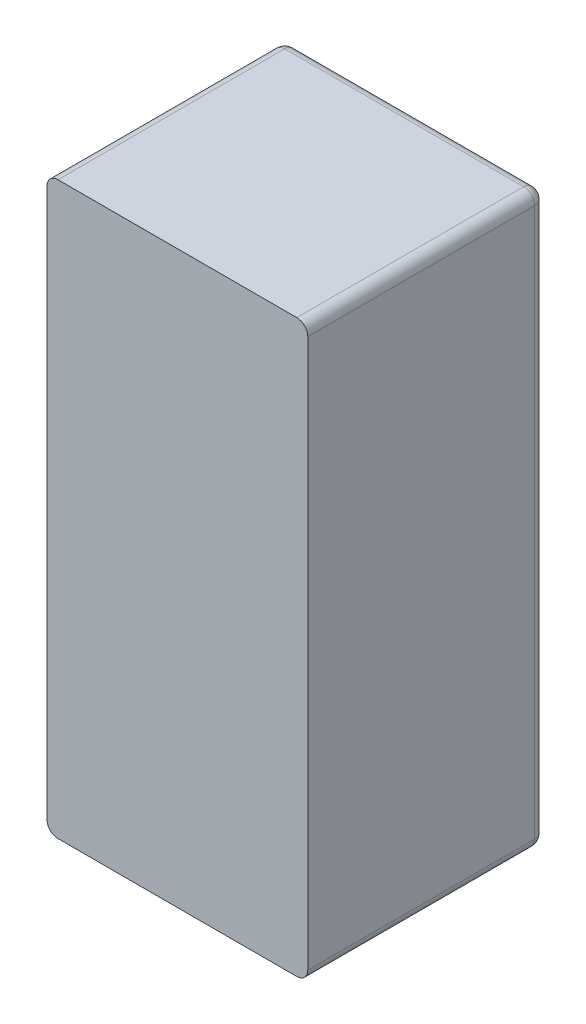
ISO-10303-21;
HEADER;
FILE_DESCRIPTION(('STEP AP214'),'2;1');
FILE_NAME('part.step','',(''),(''),'','','');
FILE_SCHEMA(('AUTOMOTIVE_DESIGN { 1 0 10303 214 1 1 1 1 }'));
ENDSEC;
DATA;
#1=APPLICATION_CONTEXT('core data for automotive mechanical design processes');
#2=APPLICATION_PROTOCOL_DEFINITION('international standard','automotive_design',2000,#1);
#3=PRODUCT_CONTEXT('',#1,'mechanical');
#4=PRODUCT('Part','Part','',(#3));
#5=PRODUCT_RELATED_PRODUCT_CATEGORY('part','',(#4));
#6=PRODUCT_DEFINITION_FORMATION('','',#4);
#7=PRODUCT_DEFINITION_CONTEXT('part definition',#1,'design');
#8=PRODUCT_DEFINITION('design','',#6,#7);
#9=PRODUCT_DEFINITION_SHAPE('','',#8);
#10=(LENGTH_UNIT() NAMED_UNIT(*) SI_UNIT(.MILLI.,.METRE.));
#11=(NAMED_UNIT(*) PLANE_ANGLE_UNIT() SI_UNIT($,.RADIAN.));
#12=(NAMED_UNIT(*) SI_UNIT($,.STERADIAN.) SOLID_ANGLE_UNIT());
#13=UNCERTAINTY_MEASURE_WITH_UNIT(LENGTH_MEASURE(1.E-05),#10,'distance_accuracy_value','');
#14=(GEOMETRIC_REPRESENTATION_CONTEXT(3) GLOBAL_UNCERTAINTY_ASSIGNED_CONTEXT((#13)) GLOBAL_UNIT_ASSIGNED_CONTEXT((#10,
#11,#12)) REPRESENTATION_CONTEXT('',''));
#15=CARTESIAN_POINT('',(0.,0.,0.));
#16=DIRECTION('',(0.,0.,1.));
#17=DIRECTION('',(1.,0.,0.));
#18=AXIS2_PLACEMENT_3D('',#15,#16,#17);
#19=CARTESIAN_POINT('',(0.,520.7,0.));
#20=DIRECTION('',(-1.,0.,0.));
#21=DIRECTION('',(0.,0.,1.));
#22=AXIS2_PLACEMENT_3D('',#19,#20,#21);
#23=PLANE('',#22);
#24=DIRECTION('',(0.,-1.,0.));
#25=VECTOR('',#24,1.);
#26=CARTESIAN_POINT('',(0.,520.7,10.));
#27=LINE('',#26,#25);
#28=CARTESIAN_POINT('',(0.,10.,10.));
#29=VERTEX_POINT('',#28);
#30=CARTESIAN_POINT('',(0.,510.7,10.));
#31=VERTEX_POINT('',#30);
#32=EDGE_CURVE('E125',#29,#31,#27,.F.);
#33=ORIENTED_EDGE('',*,*,#32,.T.);
#34=DIRECTION('',(0.,0.,-1.));
#35=VECTOR('',#34,1.);
#36=CARTESIAN_POINT('',(0.,510.7,0.));
#37=LINE('',#36,#35);
#38=CARTESIAN_POINT('',(0.,510.7,216.916));
#39=VERTEX_POINT('',#38);
#40=EDGE_CURVE('E167',#31,#39,#37,.F.);
#41=ORIENTED_EDGE('',*,*,#40,.T.);
#42=DIRECTION('',(0.,-1.,0.));
#43=VECTOR('',#42,1.);
#44=CARTESIAN_POINT('',(0.,520.7,216.916));
#45=LINE('',#44,#43);
#46=CARTESIAN_POINT('',(0.,10.,216.916));
#47=VERTEX_POINT('',#46);
#48=EDGE_CURVE('E245',#39,#47,#45,.T.);
#49=ORIENTED_EDGE('',*,*,#48,.T.);
#50=DIRECTION('',(0.,0.,-1.));
#51=VECTOR('',#50,1.);
#52=CARTESIAN_POINT('',(0.,10.,0.));
#53=LINE('',#52,#51);
#54=EDGE_CURVE('E157',#47,#29,#53,.T.);
#55=ORIENTED_EDGE('',*,*,#54,.T.);
#56=EDGE_LOOP('',(#33,#41,#49,#55));
#57=FACE_BOUND('',#56,.T.);
#58=ADVANCED_FACE('F39',(#57),#23,.F.);
#59=CARTESIAN_POINT('',(0.,520.7,0.));
#60=DIRECTION('',(0.,0.,1.));
#61=DIRECTION('',(1.,0.,0.));
#62=AXIS2_PLACEMENT_3D('',#59,#60,#61);
#63=PLANE('',#62);
#64=DIRECTION('',(-1.,0.,0.));
#65=VECTOR('',#64,1.);
#66=CARTESIAN_POINT('',(0.,510.7,0.));
#67=LINE('',#66,#65);
#68=CARTESIAN_POINT('',(-227.998,510.7,0.));
#69=VERTEX_POINT('',#68);
#70=CARTESIAN_POINT('',(-10.,510.7,0.));
#71=VERTEX_POINT('',#70);
#72=EDGE_CURVE('E154',#69,#71,#67,.F.);
#73=ORIENTED_EDGE('',*,*,#72,.T.);
#74=DIRECTION('',(0.,-1.,0.));
#75=VECTOR('',#74,1.);
#76=CARTESIAN_POINT('',(-10.,520.7,0.));
#77=LINE('',#76,#75);
#78=CARTESIAN_POINT('',(-10.,10.,0.));
#79=VERTEX_POINT('',#78);
#80=EDGE_CURVE('E123',#71,#79,#77,.T.);
#81=ORIENTED_EDGE('',*,*,#80,.T.);
#82=DIRECTION('',(-1.,0.,0.));
#83=VECTOR('',#82,1.);
#84=CARTESIAN_POINT('',(-237.998,10.,0.));
#85=LINE('',#84,#83);
#86=CARTESIAN_POINT('',(-227.998,10.,0.));
#87=VERTEX_POINT('',#86);
#88=EDGE_CURVE('E142',#79,#87,#85,.T.);
#89=ORIENTED_EDGE('',*,*,#88,.T.);
#90=DIRECTION('',(0.,-1.,0.));
#91=VECTOR('',#90,1.);
#92=CARTESIAN_POINT('',(-227.998,520.7,0.));
#93=LINE('',#92,#91);
#94=EDGE_CURVE('E149',#87,#69,#93,.F.);
#95=ORIENTED_EDGE('',*,*,#94,.T.);
#96=EDGE_LOOP('',(#73,#81,#89,#95));
#97=FACE_BOUND('',#96,.T.);
#98=ADVANCED_FACE('F152',(#97),#63,.F.);
#99=CARTESIAN_POINT('',(-237.998,520.7,0.));
#100=DIRECTION('',(1.,0.,0.));
#101=DIRECTION('',(0.,0.,-1.));
#102=AXIS2_PLACEMENT_3D('',#99,#100,#101);
#103=PLANE('',#102);
#104=DIRECTION('',(0.,-1.,0.));
#105=VECTOR('',#104,1.);
#106=CARTESIAN_POINT('',(-237.998,520.7,216.916));
#107=LINE('',#106,#105);
#108=CARTESIAN_POINT('',(-237.998,510.7,216.916));
#109=VERTEX_POINT('',#108);
#110=CARTESIAN_POINT('',(-237.998,10.,216.916));
#111=VERTEX_POINT('',#110);
#112=EDGE_CURVE('E150',#109,#111,#107,.T.);
#113=ORIENTED_EDGE('',*,*,#112,.F.);
#114=DIRECTION('',(0.,0.,1.));
#115=VECTOR('',#114,1.);
#116=CARTESIAN_POINT('',(-237.998,510.7,0.));
#117=LINE('',#116,#115);
#118=CARTESIAN_POINT('',(-237.998,510.7,10.));
#119=VERTEX_POINT('',#118);
#120=EDGE_CURVE('E185',#109,#119,#117,.F.);
#121=ORIENTED_EDGE('',*,*,#120,.T.);
#122=DIRECTION('',(0.,-1.,0.));
#123=VECTOR('',#122,1.);
#124=CARTESIAN_POINT('',(-237.998,520.7,10.));
#125=LINE('',#124,#123);
#126=CARTESIAN_POINT('',(-237.998,10.,10.));
#127=VERTEX_POINT('',#126);
#128=EDGE_CURVE('E182',#119,#127,#125,.T.);
#129=ORIENTED_EDGE('',*,*,#128,.T.);
#130=DIRECTION('',(0.,0.,1.));
#131=VECTOR('',#130,1.);
#132=CARTESIAN_POINT('',(-237.998,10.,216.916));
#133=LINE('',#132,#131);
#134=EDGE_CURVE('E179',#127,#111,#133,.T.);
#135=ORIENTED_EDGE('',*,*,#134,.T.);
#136=EDGE_LOOP('',(#113,#121,#129,#135));
#137=FACE_BOUND('',#136,.T.);
#138=ADVANCED_FACE('F296',(#137),#103,.F.);
#139=CARTESIAN_POINT('',(0.,520.7,216.916));
#140=DIRECTION('',(0.,0.,-1.));
#141=DIRECTION('',(-1.,0.,0.));
#142=AXIS2_PLACEMENT_3D('',#139,#140,#141);
#143=PLANE('',#142);
#144=DIRECTION('',(1.,0.,0.));
#145=VECTOR('',#144,1.);
#146=CARTESIAN_POINT('',(0.,520.7,216.916));
#147=LINE('',#146,#145);
#148=CARTESIAN_POINT('',(-227.998,520.7,216.916));
#149=VERTEX_POINT('',#148);
#150=CARTESIAN_POINT('',(-10.,520.7,216.916));
#151=VERTEX_POINT('',#150);
#152=EDGE_CURVE('E239',#149,#151,#147,.T.);
#153=ORIENTED_EDGE('',*,*,#152,.F.);
#154=CARTESIAN_POINT('',(-227.998,510.7,216.916));
#155=DIRECTION('',(0.,0.,-1.));
#156=DIRECTION('',(-1.,0.,0.));
#157=AXIS2_PLACEMENT_3D('',#154,#155,#156);
#158=CIRCLE('',#157,10.);
#159=EDGE_CURVE('E11',#149,#109,#158,.F.);
#160=ORIENTED_EDGE('',*,*,#159,.T.);
#161=ORIENTED_EDGE('',*,*,#112,.T.);
#162=CARTESIAN_POINT('',(-227.998,10.,216.916));
#163=DIRECTION('',(0.,0.,-1.));
#164=DIRECTION('',(-1.,0.,0.));
#165=AXIS2_PLACEMENT_3D('',#162,#163,#164);
#166=CIRCLE('',#165,10.);
#167=CARTESIAN_POINT('',(-227.998,0.,216.916));
#168=VERTEX_POINT('',#167);
#169=EDGE_CURVE('E49',#111,#168,#166,.F.);
#170=ORIENTED_EDGE('',*,*,#169,.T.);
#171=DIRECTION('',(1.,0.,0.));
#172=VECTOR('',#171,1.);
#173=CARTESIAN_POINT('',(0.,0.,216.916));
#174=LINE('',#173,#172);
#175=CARTESIAN_POINT('',(-10.,0.,216.916));
#176=VERTEX_POINT('',#175);
#177=EDGE_CURVE('E235',#168,#176,#174,.T.);
#178=ORIENTED_EDGE('',*,*,#177,.T.);
#179=CARTESIAN_POINT('',(-10.,10.,216.916));
#180=DIRECTION('',(0.,0.,-1.));
#181=DIRECTION('',(-1.,0.,0.));
#182=AXIS2_PLACEMENT_3D('',#179,#180,#181);
#183=CIRCLE('',#182,10.);
#184=EDGE_CURVE('E195',#176,#47,#183,.F.);
#185=ORIENTED_EDGE('',*,*,#184,.T.);
#186=ORIENTED_EDGE('',*,*,#48,.F.);
#187=CARTESIAN_POINT('',(-10.,510.7,216.916));
#188=DIRECTION('',(0.,0.,-1.));
#189=DIRECTION('',(-1.,0.,0.));
#190=AXIS2_PLACEMENT_3D('',#187,#188,#189);
#191=CIRCLE('',#190,10.);
#192=EDGE_CURVE('E198',#39,#151,#191,.F.);
#193=ORIENTED_EDGE('',*,*,#192,.T.);
#194=EDGE_LOOP('',(#153,#160,#161,#170,#178,#185,#186,#193));
#195=FACE_BOUND('',#194,.T.);
#196=ADVANCED_FACE('F396',(#195),#143,.F.);
#197=CARTESIAN_POINT('',(0.,520.7,0.));
#198=DIRECTION('',(0.,-1.,0.));
#199=DIRECTION('',(0.,0.,-1.));
#200=AXIS2_PLACEMENT_3D('',#197,#198,#199);
#201=PLANE('',#200);
#202=DIRECTION('',(-1.,0.,0.));
#203=VECTOR('',#202,1.);
#204=CARTESIAN_POINT('',(0.,520.7,10.));
#205=LINE('',#204,#203);
#206=CARTESIAN_POINT('',(-10.,520.7,10.));
#207=VERTEX_POINT('',#206);
#208=CARTESIAN_POINT('',(-227.998,520.7,10.));
#209=VERTEX_POINT('',#208);
#210=EDGE_CURVE('E173',#207,#209,#205,.T.);
#211=ORIENTED_EDGE('',*,*,#210,.T.);
#212=DIRECTION('',(0.,0.,1.));
#213=VECTOR('',#212,1.);
#214=CARTESIAN_POINT('',(-227.998,520.7,0.));
#215=LINE('',#214,#213);
#216=EDGE_CURVE('E176',#209,#149,#215,.T.);
#217=ORIENTED_EDGE('',*,*,#216,.T.);
#218=ORIENTED_EDGE('',*,*,#152,.T.);
#219=DIRECTION('',(0.,0.,-1.));
#220=VECTOR('',#219,1.);
#221=CARTESIAN_POINT('',(-10.,520.7,0.));
#222=LINE('',#221,#220);
#223=EDGE_CURVE('E170',#151,#207,#222,.T.);
#224=ORIENTED_EDGE('',*,*,#223,.T.);
#225=EDGE_LOOP('',(#211,#217,#218,#224));
#226=FACE_BOUND('',#225,.T.);
#227=ADVANCED_FACE('F388',(#226),#201,.F.);
#228=CARTESIAN_POINT('',(0.,0.,0.));
#229=DIRECTION('',(0.,-1.,0.));
#230=DIRECTION('',(0.,0.,-1.));
#231=AXIS2_PLACEMENT_3D('',#228,#229,#230);
#232=PLANE('',#231);
#233=ORIENTED_EDGE('',*,*,#177,.F.);
#234=DIRECTION('',(0.,0.,1.));
#235=VECTOR('',#234,1.);
#236=CARTESIAN_POINT('',(-227.998,0.,0.));
#237=LINE('',#236,#235);
#238=CARTESIAN_POINT('',(-227.998,0.,10.));
#239=VERTEX_POINT('',#238);
#240=EDGE_CURVE('E57',#168,#239,#237,.F.);
#241=ORIENTED_EDGE('',*,*,#240,.T.);
#242=DIRECTION('',(-1.,0.,0.));
#243=VECTOR('',#242,1.);
#244=CARTESIAN_POINT('',(0.,0.,10.));
#245=LINE('',#244,#243);
#246=CARTESIAN_POINT('',(-10.,0.,10.));
#247=VERTEX_POINT('',#246);
#248=EDGE_CURVE('E62',#239,#247,#245,.F.);
#249=ORIENTED_EDGE('',*,*,#248,.T.);
#250=DIRECTION('',(0.,0.,-1.));
#251=VECTOR('',#250,1.);
#252=CARTESIAN_POINT('',(-10.,0.,216.916));
#253=LINE('',#252,#251);
#254=EDGE_CURVE('E188',#247,#176,#253,.F.);
#255=ORIENTED_EDGE('',*,*,#254,.T.);
#256=EDGE_LOOP('',(#233,#241,#249,#255));
#257=FACE_BOUND('',#256,.T.);
#258=ADVANCED_FACE('F276',(#257),#232,.T.);
#259=CARTESIAN_POINT('',(-227.998,510.7,0.));
#260=DIRECTION('',(0.,0.,1.));
#261=DIRECTION('',(1.,0.,0.));
#262=AXIS2_PLACEMENT_3D('',#259,#260,#261);
#263=CYLINDRICAL_SURFACE('',#262,10.);
#264=ORIENTED_EDGE('',*,*,#159,.F.);
#265=ORIENTED_EDGE('',*,*,#216,.F.);
#266=CARTESIAN_POINT('',(-227.998,510.7,10.));
#267=DIRECTION('',(0.,0.,-1.));
#268=DIRECTION('',(-1.,0.,0.));
#269=AXIS2_PLACEMENT_3D('',#266,#267,#268);
#270=CIRCLE('',#269,10.);
#271=EDGE_CURVE('E43',#119,#209,#270,.T.);
#272=ORIENTED_EDGE('',*,*,#271,.F.);
#273=ORIENTED_EDGE('',*,*,#120,.F.);
#274=EDGE_LOOP('',(#264,#265,#272,#273));
#275=FACE_BOUND('',#274,.T.);
#276=ADVANCED_FACE('F41',(#275),#263,.T.);
#277=CARTESIAN_POINT('',(-227.998,520.7,10.));
#278=DIRECTION('',(0.,-1.,0.));
#279=DIRECTION('',(0.,0.,-1.));
#280=AXIS2_PLACEMENT_3D('',#277,#278,#279);
#281=CYLINDRICAL_SURFACE('',#280,10.);
#282=CARTESIAN_POINT('',(-227.998,10.,10.));
#283=DIRECTION('',(0.,-1.,0.));
#284=DIRECTION('',(0.,0.,-1.));
#285=AXIS2_PLACEMENT_3D('',#282,#283,#284);
#286=CIRCLE('',#285,10.);
#287=EDGE_CURVE('E224',#127,#87,#286,.T.);
#288=ORIENTED_EDGE('',*,*,#287,.F.);
#289=ORIENTED_EDGE('',*,*,#128,.F.);
#290=CARTESIAN_POINT('',(-227.998,510.7,10.));
#291=DIRECTION('',(0.,1.,0.));
#292=DIRECTION('',(0.,0.,1.));
#293=AXIS2_PLACEMENT_3D('',#290,#291,#292);
#294=CIRCLE('',#293,10.);
#295=EDGE_CURVE('E227',#69,#119,#294,.T.);
#296=ORIENTED_EDGE('',*,*,#295,.F.);
#297=ORIENTED_EDGE('',*,*,#94,.F.);
#298=EDGE_LOOP('',(#288,#289,#296,#297));
#299=FACE_BOUND('',#298,.T.);
#300=ADVANCED_FACE('F257',(#299),#281,.T.);
#301=CARTESIAN_POINT('',(-227.998,10.,0.));
#302=DIRECTION('',(0.,0.,-1.));
#303=DIRECTION('',(-1.,0.,0.));
#304=AXIS2_PLACEMENT_3D('',#301,#302,#303);
#305=CYLINDRICAL_SURFACE('',#304,10.);
#306=ORIENTED_EDGE('',*,*,#169,.F.);
#307=ORIENTED_EDGE('',*,*,#134,.F.);
#308=CARTESIAN_POINT('',(-227.998,10.,10.));
#309=DIRECTION('',(0.,0.,-1.));
#310=DIRECTION('',(-1.,0.,0.));
#311=AXIS2_PLACEMENT_3D('',#308,#309,#310);
#312=CIRCLE('',#311,10.);
#313=EDGE_CURVE('E220',#239,#127,#312,.T.);
#314=ORIENTED_EDGE('',*,*,#313,.F.);
#315=ORIENTED_EDGE('',*,*,#240,.F.);
#316=EDGE_LOOP('',(#306,#307,#314,#315));
#317=FACE_BOUND('',#316,.T.);
#318=ADVANCED_FACE('F279',(#317),#305,.T.);
#319=CARTESIAN_POINT('',(-227.998,510.7,10.));
#320=DIRECTION('',(-1.,0.,0.));
#321=DIRECTION('',(0.,0.,1.));
#322=AXIS2_PLACEMENT_3D('',#319,#320,#321);
#323=SPHERICAL_SURFACE('',#322,10.);
#324=ORIENTED_EDGE('',*,*,#295,.T.);
#325=ORIENTED_EDGE('',*,*,#271,.T.);
#326=CARTESIAN_POINT('',(-227.998,510.7,10.));
#327=DIRECTION('',(-1.,0.,0.));
#328=DIRECTION('',(0.,0.,1.));
#329=AXIS2_PLACEMENT_3D('',#326,#327,#328);
#330=CIRCLE('',#329,10.);
#331=EDGE_CURVE('E216',#69,#209,#330,.F.);
#332=ORIENTED_EDGE('',*,*,#331,.F.);
#333=EDGE_LOOP('',(#324,#325,#332));
#334=FACE_BOUND('',#333,.T.);
#335=ADVANCED_FACE('F258',(#334),#323,.T.);
#336=CARTESIAN_POINT('',(-227.998,10.,10.));
#337=DIRECTION('',(-1.,0.,0.));
#338=DIRECTION('',(0.,-1.,0.));
#339=AXIS2_PLACEMENT_3D('',#336,#337,#338);
#340=SPHERICAL_SURFACE('',#339,10.);
#341=ORIENTED_EDGE('',*,*,#313,.T.);
#342=ORIENTED_EDGE('',*,*,#287,.T.);
#343=CARTESIAN_POINT('',(-227.998,10.,10.));
#344=DIRECTION('',(-1.,0.,0.));
#345=DIRECTION('',(0.,0.,1.));
#346=AXIS2_PLACEMENT_3D('',#343,#344,#345);
#347=CIRCLE('',#346,10.);
#348=EDGE_CURVE('E145',#239,#87,#347,.F.);
#349=ORIENTED_EDGE('',*,*,#348,.F.);
#350=EDGE_LOOP('',(#341,#342,#349));
#351=FACE_BOUND('',#350,.T.);
#352=ADVANCED_FACE('F282',(#351),#340,.T.);
#353=CARTESIAN_POINT('',(-10.,510.7,0.));
#354=DIRECTION('',(0.,0.,-1.));
#355=DIRECTION('',(-1.,0.,0.));
#356=AXIS2_PLACEMENT_3D('',#353,#354,#355);
#357=CYLINDRICAL_SURFACE('',#356,10.);
#358=ORIENTED_EDGE('',*,*,#192,.F.);
#359=ORIENTED_EDGE('',*,*,#40,.F.);
#360=CARTESIAN_POINT('',(-10.,510.7,10.));
#361=DIRECTION('',(0.,0.,-1.));
#362=DIRECTION('',(-1.,0.,0.));
#363=AXIS2_PLACEMENT_3D('',#360,#361,#362);
#364=CIRCLE('',#363,10.);
#365=EDGE_CURVE('E210',#207,#31,#364,.T.);
#366=ORIENTED_EDGE('',*,*,#365,.F.);
#367=ORIENTED_EDGE('',*,*,#223,.F.);
#368=EDGE_LOOP('',(#358,#359,#366,#367));
#369=FACE_BOUND('',#368,.T.);
#370=ADVANCED_FACE('F270',(#369),#357,.T.);
#371=CARTESIAN_POINT('',(0.,510.7,10.));
#372=DIRECTION('',(-1.,0.,0.));
#373=DIRECTION('',(0.,0.,1.));
#374=AXIS2_PLACEMENT_3D('',#371,#372,#373);
#375=CYLINDRICAL_SURFACE('',#374,10.);
#376=ORIENTED_EDGE('',*,*,#331,.T.);
#377=ORIENTED_EDGE('',*,*,#210,.F.);
#378=CARTESIAN_POINT('',(-10.,510.7,10.));
#379=DIRECTION('',(1.,0.,0.));
#380=DIRECTION('',(0.,0.,-1.));
#381=AXIS2_PLACEMENT_3D('',#378,#379,#380);
#382=CIRCLE('',#381,10.);
#383=EDGE_CURVE('E139',#71,#207,#382,.T.);
#384=ORIENTED_EDGE('',*,*,#383,.F.);
#385=ORIENTED_EDGE('',*,*,#72,.F.);
#386=EDGE_LOOP('',(#376,#377,#384,#385));
#387=FACE_BOUND('',#386,.T.);
#388=ADVANCED_FACE('F261',(#387),#375,.T.);
#389=CARTESIAN_POINT('',(0.,10.,10.));
#390=DIRECTION('',(1.,0.,0.));
#391=DIRECTION('',(0.,0.,-1.));
#392=AXIS2_PLACEMENT_3D('',#389,#390,#391);
#393=CYLINDRICAL_SURFACE('',#392,10.);
#394=ORIENTED_EDGE('',*,*,#348,.T.);
#395=ORIENTED_EDGE('',*,*,#88,.F.);
#396=CARTESIAN_POINT('',(-10.,10.,10.));
#397=DIRECTION('',(1.,0.,0.));
#398=DIRECTION('',(0.,0.,-1.));
#399=AXIS2_PLACEMENT_3D('',#396,#397,#398);
#400=CIRCLE('',#399,10.);
#401=EDGE_CURVE('E132',#247,#79,#400,.T.);
#402=ORIENTED_EDGE('',*,*,#401,.F.);
#403=ORIENTED_EDGE('',*,*,#248,.F.);
#404=EDGE_LOOP('',(#394,#395,#402,#403));
#405=FACE_BOUND('',#404,.T.);
#406=ADVANCED_FACE('F143',(#405),#393,.T.);
#407=CARTESIAN_POINT('',(-10.,10.,0.));
#408=DIRECTION('',(0.,0.,1.));
#409=DIRECTION('',(1.,0.,0.));
#410=AXIS2_PLACEMENT_3D('',#407,#408,#409);
#411=CYLINDRICAL_SURFACE('',#410,10.);
#412=ORIENTED_EDGE('',*,*,#184,.F.);
#413=ORIENTED_EDGE('',*,*,#254,.F.);
#414=CARTESIAN_POINT('',(-10.,10.,10.));
#415=DIRECTION('',(0.,0.,-1.));
#416=DIRECTION('',(-1.,0.,0.));
#417=AXIS2_PLACEMENT_3D('',#414,#415,#416);
#418=CIRCLE('',#417,10.);
#419=EDGE_CURVE('E136',#29,#247,#418,.T.);
#420=ORIENTED_EDGE('',*,*,#419,.F.);
#421=ORIENTED_EDGE('',*,*,#54,.F.);
#422=EDGE_LOOP('',(#412,#413,#420,#421));
#423=FACE_BOUND('',#422,.T.);
#424=ADVANCED_FACE('F275',(#423),#411,.T.);
#425=CARTESIAN_POINT('',(-10.,510.7,10.));
#426=DIRECTION('',(0.,1.,0.));
#427=DIRECTION('',(0.,0.,1.));
#428=AXIS2_PLACEMENT_3D('',#425,#426,#427);
#429=SPHERICAL_SURFACE('',#428,10.);
#430=ORIENTED_EDGE('',*,*,#383,.T.);
#431=ORIENTED_EDGE('',*,*,#365,.T.);
#432=CARTESIAN_POINT('',(-10.,510.7,10.));
#433=DIRECTION('',(0.,1.,0.));
#434=DIRECTION('',(0.,0.,1.));
#435=AXIS2_PLACEMENT_3D('',#432,#433,#434);
#436=CIRCLE('',#435,10.);
#437=EDGE_CURVE('E129',#71,#31,#436,.F.);
#438=ORIENTED_EDGE('',*,*,#437,.F.);
#439=EDGE_LOOP('',(#430,#431,#438));
#440=FACE_BOUND('',#439,.T.);
#441=ADVANCED_FACE('F265',(#440),#429,.T.);
#442=CARTESIAN_POINT('',(-10.,10.,10.));
#443=DIRECTION('',(0.,-1.,0.));
#444=DIRECTION('',(0.,0.,-1.));
#445=AXIS2_PLACEMENT_3D('',#442,#443,#444);
#446=SPHERICAL_SURFACE('',#445,10.);
#447=ORIENTED_EDGE('',*,*,#419,.T.);
#448=ORIENTED_EDGE('',*,*,#401,.T.);
#449=CARTESIAN_POINT('',(-10.,10.,10.));
#450=DIRECTION('',(0.,-1.,0.));
#451=DIRECTION('',(0.,0.,-1.));
#452=AXIS2_PLACEMENT_3D('',#449,#450,#451);
#453=CIRCLE('',#452,10.);
#454=EDGE_CURVE('E119',#29,#79,#453,.F.);
#455=ORIENTED_EDGE('',*,*,#454,.F.);
#456=EDGE_LOOP('',(#447,#448,#455));
#457=FACE_BOUND('',#456,.T.);
#458=ADVANCED_FACE('F134',(#457),#446,.T.);
#459=CARTESIAN_POINT('',(-10.,520.7,10.));
#460=DIRECTION('',(0.,-1.,0.));
#461=DIRECTION('',(0.,0.,-1.));
#462=AXIS2_PLACEMENT_3D('',#459,#460,#461);
#463=CYLINDRICAL_SURFACE('',#462,10.);
#464=ORIENTED_EDGE('',*,*,#437,.T.);
#465=ORIENTED_EDGE('',*,*,#32,.F.);
#466=ORIENTED_EDGE('',*,*,#454,.T.);
#467=ORIENTED_EDGE('',*,*,#80,.F.);
#468=EDGE_LOOP('',(#464,#465,#466,#467));
#469=FACE_BOUND('',#468,.T.);
#470=ADVANCED_FACE('F121',(#469),#463,.T.);
#471=CLOSED_SHELL('',(#58,#98,#138,#196,#227,#258,#276,#300,#318,#335,#352,#370,#388,#406,#424,
#441,#458,#470));
#472=MANIFOLD_SOLID_BREP('B2',#471);
#473=ADVANCED_BREP_SHAPE_REPRESENTATION('',(#18,#472),#14);
#474=SHAPE_DEFINITION_REPRESENTATION(#9,#473);
ENDSEC;
END-ISO-10303-21;
